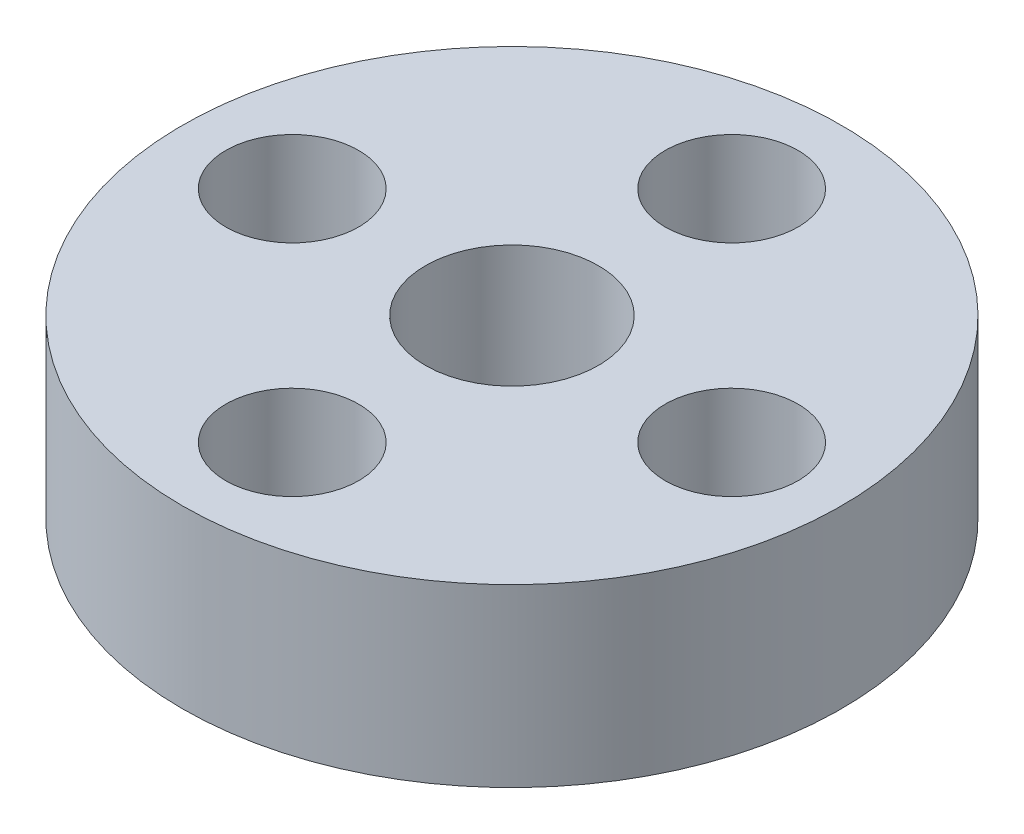
ISO-10303-21;
HEADER;
FILE_DESCRIPTION(('STEP AP214'),'2;1');
FILE_NAME('part.step','',(''),(''),'','','');
FILE_SCHEMA(('AUTOMOTIVE_DESIGN { 1 0 10303 214 1 1 1 1 }'));
ENDSEC;
DATA;
#1=APPLICATION_CONTEXT('core data for automotive mechanical design processes');
#2=APPLICATION_PROTOCOL_DEFINITION('international standard','automotive_design',2000,#1);
#3=PRODUCT_CONTEXT('',#1,'mechanical');
#4=PRODUCT('Part','Part','',(#3));
#5=PRODUCT_RELATED_PRODUCT_CATEGORY('part','',(#4));
#6=PRODUCT_DEFINITION_FORMATION('','',#4);
#7=PRODUCT_DEFINITION_CONTEXT('part definition',#1,'design');
#8=PRODUCT_DEFINITION('design','',#6,#7);
#9=PRODUCT_DEFINITION_SHAPE('','',#8);
#10=(LENGTH_UNIT() NAMED_UNIT(*) SI_UNIT(.MILLI.,.METRE.));
#11=(NAMED_UNIT(*) PLANE_ANGLE_UNIT() SI_UNIT($,.RADIAN.));
#12=(NAMED_UNIT(*) SI_UNIT($,.STERADIAN.) SOLID_ANGLE_UNIT());
#13=UNCERTAINTY_MEASURE_WITH_UNIT(LENGTH_MEASURE(1.E-05),#10,'distance_accuracy_value','');
#14=(GEOMETRIC_REPRESENTATION_CONTEXT(3) GLOBAL_UNCERTAINTY_ASSIGNED_CONTEXT((#13)) GLOBAL_UNIT_ASSIGNED_CONTEXT((#10,
#11,#12)) REPRESENTATION_CONTEXT('',''));
#15=CARTESIAN_POINT('',(0.,0.,0.));
#16=DIRECTION('',(0.,0.,1.));
#17=DIRECTION('',(1.,0.,0.));
#18=AXIS2_PLACEMENT_3D('',#15,#16,#17);
#19=CARTESIAN_POINT('',(0.,5.08,0.));
#20=DIRECTION('',(0.,1.,0.));
#21=DIRECTION('',(0.,0.,1.));
#22=AXIS2_PLACEMENT_3D('',#19,#20,#21);
#23=PLANE('',#22);
#24=CARTESIAN_POINT('',(3.59400408331214E-13,5.08,6.35));
#25=DIRECTION('',(0.,1.,0.));
#26=DIRECTION('',(0.,0.,1.));
#27=AXIS2_PLACEMENT_3D('',#24,#25,#26);
#28=CIRCLE('',#27,1.92000000000039);
#29=CARTESIAN_POINT('',(3.59400408331214E-13,5.08,8.27000000000039));
#30=VERTEX_POINT('',#29);
#31=EDGE_CURVE('E62',#30,#30,#28,.T.);
#32=ORIENTED_EDGE('',*,*,#31,.F.);
#33=EDGE_LOOP('',(#32));
#34=FACE_BOUND('',#33,.T.);
#35=CARTESIAN_POINT('',(6.35000000000018,5.08,-1.79700204165607E-13));
#36=DIRECTION('',(0.,1.,0.));
#37=DIRECTION('',(0.,0.,1.));
#38=AXIS2_PLACEMENT_3D('',#35,#36,#37);
#39=CIRCLE('',#38,1.92000000000014);
#40=CARTESIAN_POINT('',(6.35000000000018,5.08,1.91999999999996));
#41=VERTEX_POINT('',#40);
#42=EDGE_CURVE('E50',#41,#41,#39,.T.);
#43=ORIENTED_EDGE('',*,*,#42,.F.);
#44=EDGE_LOOP('',(#43));
#45=FACE_BOUND('',#44,.T.);
#46=CARTESIAN_POINT('',(0.,5.08,0.));
#47=DIRECTION('',(0.,1.,0.));
#48=DIRECTION('',(0.,0.,1.));
#49=AXIS2_PLACEMENT_3D('',#46,#47,#48);
#50=CIRCLE('',#49,9.525);
#51=CARTESIAN_POINT('',(0.,5.08,9.525));
#52=VERTEX_POINT('',#51);
#53=EDGE_CURVE('E10',#52,#52,#50,.T.);
#54=ORIENTED_EDGE('',*,*,#53,.T.);
#55=EDGE_LOOP('',(#54));
#56=FACE_BOUND('',#55,.T.);
#57=CARTESIAN_POINT('',(0.,5.08,-6.35));
#58=DIRECTION('',(0.,1.,0.));
#59=DIRECTION('',(0.,0.,1.));
#60=AXIS2_PLACEMENT_3D('',#57,#58,#59);
#61=CIRCLE('',#60,1.92);
#62=CARTESIAN_POINT('',(0.,5.08,-4.43));
#63=VERTEX_POINT('',#62);
#64=EDGE_CURVE('E45',#63,#63,#61,.T.);
#65=ORIENTED_EDGE('',*,*,#64,.F.);
#66=EDGE_LOOP('',(#65));
#67=FACE_BOUND('',#66,.T.);
#68=CARTESIAN_POINT('',(0.,5.08,0.));
#69=DIRECTION('',(0.,1.,0.));
#70=DIRECTION('',(0.,0.,1.));
#71=AXIS2_PLACEMENT_3D('',#68,#69,#70);
#72=CIRCLE('',#71,2.5);
#73=CARTESIAN_POINT('',(0.,5.08,2.5));
#74=VERTEX_POINT('',#73);
#75=EDGE_CURVE('E56',#74,#74,#72,.T.);
#76=ORIENTED_EDGE('',*,*,#75,.F.);
#77=EDGE_LOOP('',(#76));
#78=FACE_BOUND('',#77,.T.);
#79=CARTESIAN_POINT('',(-6.34999999999982,5.08,1.80477854883065E-13));
#80=DIRECTION('',(0.,1.,0.));
#81=DIRECTION('',(0.,0.,1.));
#82=AXIS2_PLACEMENT_3D('',#79,#80,#81);
#83=CIRCLE('',#82,1.92000000000029);
#84=CARTESIAN_POINT('',(-6.34999999999982,5.08,1.92000000000047));
#85=VERTEX_POINT('',#84);
#86=EDGE_CURVE('E68',#85,#85,#83,.T.);
#87=ORIENTED_EDGE('',*,*,#86,.F.);
#88=EDGE_LOOP('',(#87));
#89=FACE_BOUND('',#88,.T.);
#90=ADVANCED_FACE('F34',(#34,#45,#56,#67,#78,#89),#23,.T.);
#91=CARTESIAN_POINT('',(0.,0.,0.));
#92=DIRECTION('',(0.,1.,0.));
#93=DIRECTION('',(0.,0.,1.));
#94=AXIS2_PLACEMENT_3D('',#91,#92,#93);
#95=PLANE('',#94);
#96=CARTESIAN_POINT('',(0.,0.,0.));
#97=DIRECTION('',(0.,1.,0.));
#98=DIRECTION('',(0.,0.,1.));
#99=AXIS2_PLACEMENT_3D('',#96,#97,#98);
#100=CIRCLE('',#99,9.525);
#101=CARTESIAN_POINT('',(0.,0.,9.525));
#102=VERTEX_POINT('',#101);
#103=EDGE_CURVE('E38',#102,#102,#100,.T.);
#104=ORIENTED_EDGE('',*,*,#103,.F.);
#105=EDGE_LOOP('',(#104));
#106=FACE_BOUND('',#105,.T.);
#107=CARTESIAN_POINT('',(0.,0.,-6.35));
#108=DIRECTION('',(0.,1.,0.));
#109=DIRECTION('',(0.,0.,1.));
#110=AXIS2_PLACEMENT_3D('',#107,#108,#109);
#111=CIRCLE('',#110,1.92);
#112=CARTESIAN_POINT('',(0.,0.,-4.43));
#113=VERTEX_POINT('',#112);
#114=EDGE_CURVE('E47',#113,#113,#111,.T.);
#115=ORIENTED_EDGE('',*,*,#114,.T.);
#116=EDGE_LOOP('',(#115));
#117=FACE_BOUND('',#116,.T.);
#118=CARTESIAN_POINT('',(6.35000000000018,0.,-1.79700204165607E-13));
#119=DIRECTION('',(0.,1.,0.));
#120=DIRECTION('',(0.,0.,1.));
#121=AXIS2_PLACEMENT_3D('',#118,#119,#120);
#122=CIRCLE('',#121,1.92000000000014);
#123=CARTESIAN_POINT('',(6.35000000000018,0.,1.91999999999996));
#124=VERTEX_POINT('',#123);
#125=EDGE_CURVE('E53',#124,#124,#122,.T.);
#126=ORIENTED_EDGE('',*,*,#125,.T.);
#127=EDGE_LOOP('',(#126));
#128=FACE_BOUND('',#127,.T.);
#129=CARTESIAN_POINT('',(0.,0.,0.));
#130=DIRECTION('',(0.,1.,0.));
#131=DIRECTION('',(0.,0.,1.));
#132=AXIS2_PLACEMENT_3D('',#129,#130,#131);
#133=CIRCLE('',#132,2.5);
#134=CARTESIAN_POINT('',(0.,0.,2.5));
#135=VERTEX_POINT('',#134);
#136=EDGE_CURVE('E59',#135,#135,#133,.T.);
#137=ORIENTED_EDGE('',*,*,#136,.T.);
#138=EDGE_LOOP('',(#137));
#139=FACE_BOUND('',#138,.T.);
#140=CARTESIAN_POINT('',(3.59400408331214E-13,0.,6.35));
#141=DIRECTION('',(0.,1.,0.));
#142=DIRECTION('',(0.,0.,1.));
#143=AXIS2_PLACEMENT_3D('',#140,#141,#142);
#144=CIRCLE('',#143,1.92000000000039);
#145=CARTESIAN_POINT('',(3.59400408331214E-13,0.,8.27000000000039));
#146=VERTEX_POINT('',#145);
#147=EDGE_CURVE('E65',#146,#146,#144,.T.);
#148=ORIENTED_EDGE('',*,*,#147,.T.);
#149=EDGE_LOOP('',(#148));
#150=FACE_BOUND('',#149,.T.);
#151=CARTESIAN_POINT('',(-6.34999999999982,0.,1.80477854883065E-13));
#152=DIRECTION('',(0.,1.,0.));
#153=DIRECTION('',(0.,0.,1.));
#154=AXIS2_PLACEMENT_3D('',#151,#152,#153);
#155=CIRCLE('',#154,1.92000000000029);
#156=CARTESIAN_POINT('',(-6.34999999999982,0.,1.92000000000047));
#157=VERTEX_POINT('',#156);
#158=EDGE_CURVE('E71',#157,#157,#155,.T.);
#159=ORIENTED_EDGE('',*,*,#158,.T.);
#160=EDGE_LOOP('',(#159));
#161=FACE_BOUND('',#160,.T.);
#162=ADVANCED_FACE('F81',(#106,#117,#128,#139,#150,#161),#95,.F.);
#163=CARTESIAN_POINT('',(0.,5.08,0.));
#164=DIRECTION('',(0.,-1.,0.));
#165=DIRECTION('',(0.,0.,-1.));
#166=AXIS2_PLACEMENT_3D('',#163,#164,#165);
#167=CYLINDRICAL_SURFACE('',#166,9.525);
#168=ORIENTED_EDGE('',*,*,#53,.F.);
#169=EDGE_LOOP('',(#168));
#170=FACE_BOUND('',#169,.T.);
#171=ORIENTED_EDGE('',*,*,#103,.T.);
#172=EDGE_LOOP('',(#171));
#173=FACE_BOUND('',#172,.T.);
#174=ADVANCED_FACE('F36',(#170,#173),#167,.T.);
#175=CARTESIAN_POINT('',(0.,5.08,-6.35));
#176=DIRECTION('',(0.,-1.,0.));
#177=DIRECTION('',(0.,0.,-1.));
#178=AXIS2_PLACEMENT_3D('',#175,#176,#177);
#179=CYLINDRICAL_SURFACE('',#178,1.92);
#180=ORIENTED_EDGE('',*,*,#64,.T.);
#181=EDGE_LOOP('',(#180));
#182=FACE_BOUND('',#181,.T.);
#183=ORIENTED_EDGE('',*,*,#114,.F.);
#184=EDGE_LOOP('',(#183));
#185=FACE_BOUND('',#184,.T.);
#186=ADVANCED_FACE('F91',(#182,#185),#179,.F.);
#187=CARTESIAN_POINT('',(6.35000000000018,5.08,-1.79700204165607E-13));
#188=DIRECTION('',(0.,-1.,0.));
#189=DIRECTION('',(0.,0.,-1.));
#190=AXIS2_PLACEMENT_3D('',#187,#188,#189);
#191=CYLINDRICAL_SURFACE('',#190,1.92000000000014);
#192=ORIENTED_EDGE('',*,*,#42,.T.);
#193=EDGE_LOOP('',(#192));
#194=FACE_BOUND('',#193,.T.);
#195=ORIENTED_EDGE('',*,*,#125,.F.);
#196=EDGE_LOOP('',(#195));
#197=FACE_BOUND('',#196,.T.);
#198=ADVANCED_FACE('F94',(#194,#197),#191,.F.);
#199=CARTESIAN_POINT('',(0.,5.08,0.));
#200=DIRECTION('',(0.,-1.,0.));
#201=DIRECTION('',(0.,0.,-1.));
#202=AXIS2_PLACEMENT_3D('',#199,#200,#201);
#203=CYLINDRICAL_SURFACE('',#202,2.5);
#204=ORIENTED_EDGE('',*,*,#75,.T.);
#205=EDGE_LOOP('',(#204));
#206=FACE_BOUND('',#205,.T.);
#207=ORIENTED_EDGE('',*,*,#136,.F.);
#208=EDGE_LOOP('',(#207));
#209=FACE_BOUND('',#208,.T.);
#210=ADVANCED_FACE('F98',(#206,#209),#203,.F.);
#211=CARTESIAN_POINT('',(3.59400408331214E-13,5.08,6.35));
#212=DIRECTION('',(0.,-1.,0.));
#213=DIRECTION('',(0.,0.,-1.));
#214=AXIS2_PLACEMENT_3D('',#211,#212,#213);
#215=CYLINDRICAL_SURFACE('',#214,1.92000000000039);
#216=ORIENTED_EDGE('',*,*,#31,.T.);
#217=EDGE_LOOP('',(#216));
#218=FACE_BOUND('',#217,.T.);
#219=ORIENTED_EDGE('',*,*,#147,.F.);
#220=EDGE_LOOP('',(#219));
#221=FACE_BOUND('',#220,.T.);
#222=ADVANCED_FACE('F102',(#218,#221),#215,.F.);
#223=CARTESIAN_POINT('',(-6.34999999999982,5.08,1.80477854883065E-13));
#224=DIRECTION('',(0.,-1.,0.));
#225=DIRECTION('',(0.,0.,-1.));
#226=AXIS2_PLACEMENT_3D('',#223,#224,#225);
#227=CYLINDRICAL_SURFACE('',#226,1.92000000000029);
#228=ORIENTED_EDGE('',*,*,#86,.T.);
#229=EDGE_LOOP('',(#228));
#230=FACE_BOUND('',#229,.T.);
#231=ORIENTED_EDGE('',*,*,#158,.F.);
#232=EDGE_LOOP('',(#231));
#233=FACE_BOUND('',#232,.T.);
#234=ADVANCED_FACE('F77',(#230,#233),#227,.F.);
#235=CLOSED_SHELL('',(#90,#162,#174,#186,#198,#210,#222,#234));
#236=MANIFOLD_SOLID_BREP('B2',#235);
#237=ADVANCED_BREP_SHAPE_REPRESENTATION('',(#18,#236),#14);
#238=SHAPE_DEFINITION_REPRESENTATION(#9,#237);
ENDSEC;
END-ISO-10303-21;
